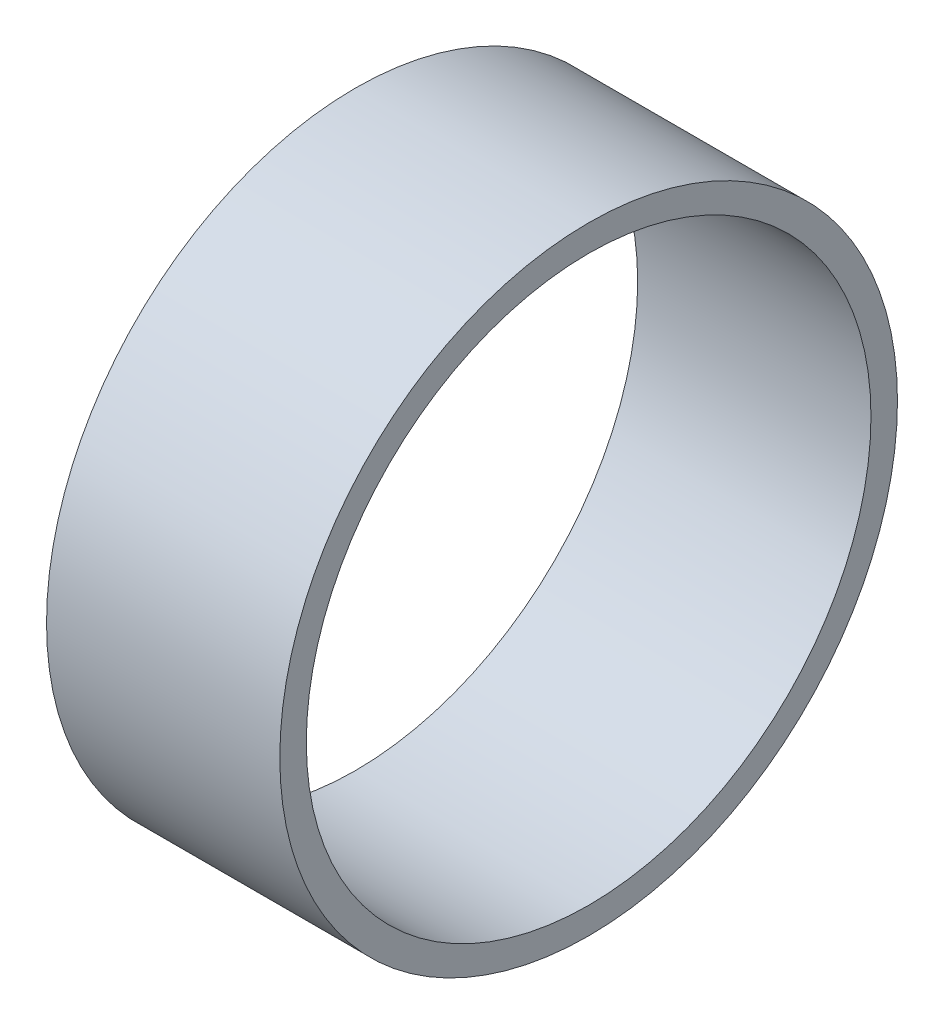
ISO-10303-21;
HEADER;
FILE_DESCRIPTION(('STEP AP214'),'2;1');
FILE_NAME('part.step','',(''),(''),'','','');
FILE_SCHEMA(('AUTOMOTIVE_DESIGN { 1 0 10303 214 1 1 1 1 }'));
ENDSEC;
DATA;
#1=APPLICATION_CONTEXT('core data for automotive mechanical design processes');
#2=APPLICATION_PROTOCOL_DEFINITION('international standard','automotive_design',2000,#1);
#3=PRODUCT_CONTEXT('',#1,'mechanical');
#4=PRODUCT('Part','Part','',(#3));
#5=PRODUCT_RELATED_PRODUCT_CATEGORY('part','',(#4));
#6=PRODUCT_DEFINITION_FORMATION('','',#4);
#7=PRODUCT_DEFINITION_CONTEXT('part definition',#1,'design');
#8=PRODUCT_DEFINITION('design','',#6,#7);
#9=PRODUCT_DEFINITION_SHAPE('','',#8);
#10=(LENGTH_UNIT() NAMED_UNIT(*) SI_UNIT(.MILLI.,.METRE.));
#11=(NAMED_UNIT(*) PLANE_ANGLE_UNIT() SI_UNIT($,.RADIAN.));
#12=(NAMED_UNIT(*) SI_UNIT($,.STERADIAN.) SOLID_ANGLE_UNIT());
#13=UNCERTAINTY_MEASURE_WITH_UNIT(LENGTH_MEASURE(1.E-05),#10,'distance_accuracy_value','');
#14=(GEOMETRIC_REPRESENTATION_CONTEXT(3) GLOBAL_UNCERTAINTY_ASSIGNED_CONTEXT((#13)) GLOBAL_UNIT_ASSIGNED_CONTEXT((#10,
#11,#12)) REPRESENTATION_CONTEXT('',''));
#15=CARTESIAN_POINT('',(0.,0.,0.));
#16=DIRECTION('',(0.,0.,1.));
#17=DIRECTION('',(1.,0.,0.));
#18=AXIS2_PLACEMENT_3D('',#15,#16,#17);
#19=CARTESIAN_POINT('',(8.8,20.1439926174438,-27.718012734749));
#20=DIRECTION('',(1.,0.,0.));
#21=DIRECTION('',(0.,0.,-1.));
#22=AXIS2_PLACEMENT_3D('',#19,#20,#21);
#23=PLANE('',#22);
#24=CARTESIAN_POINT('',(8.8,20.1439926174438,-27.718012734749));
#25=DIRECTION('',(1.,0.,0.));
#26=DIRECTION('',(0.,0.,-1.));
#27=AXIS2_PLACEMENT_3D('',#24,#25,#26);
#28=CIRCLE('',#27,11.6500000000003);
#29=CARTESIAN_POINT('',(8.8,20.1439926174438,-39.3680127347493));
#30=VERTEX_POINT('',#29);
#31=EDGE_CURVE('E12',#30,#30,#28,.T.);
#32=ORIENTED_EDGE('',*,*,#31,.T.);
#33=EDGE_LOOP('',(#32));
#34=FACE_BOUND('',#33,.T.);
#35=CARTESIAN_POINT('',(8.8,20.1439926174438,-27.718012734749));
#36=DIRECTION('',(1.,0.,0.));
#37=DIRECTION('',(0.,0.,-1.));
#38=AXIS2_PLACEMENT_3D('',#35,#36,#37);
#39=CIRCLE('',#38,10.6500000000003);
#40=CARTESIAN_POINT('',(8.8,20.1439926174438,-38.3680127347493));
#41=VERTEX_POINT('',#40);
#42=EDGE_CURVE('E55',#41,#41,#39,.T.);
#43=ORIENTED_EDGE('',*,*,#42,.F.);
#44=EDGE_LOOP('',(#43));
#45=FACE_BOUND('',#44,.T.);
#46=ADVANCED_FACE('F44',(#34,#45),#23,.T.);
#47=CARTESIAN_POINT('',(0.,20.1439926174438,-27.718012734749));
#48=DIRECTION('',(1.,0.,0.));
#49=DIRECTION('',(0.,0.,-1.));
#50=AXIS2_PLACEMENT_3D('',#47,#48,#49);
#51=PLANE('',#50);
#52=CARTESIAN_POINT('',(0.,20.1439926174438,-27.718012734749));
#53=DIRECTION('',(1.,0.,0.));
#54=DIRECTION('',(0.,0.,-1.));
#55=AXIS2_PLACEMENT_3D('',#52,#53,#54);
#56=CIRCLE('',#55,11.6500000000003);
#57=CARTESIAN_POINT('',(0.,20.1439926174438,-39.3680127347493));
#58=VERTEX_POINT('',#57);
#59=EDGE_CURVE('E48',#58,#58,#56,.T.);
#60=ORIENTED_EDGE('',*,*,#59,.F.);
#61=EDGE_LOOP('',(#60));
#62=FACE_BOUND('',#61,.T.);
#63=CARTESIAN_POINT('',(0.,20.1439926174438,-27.718012734749));
#64=DIRECTION('',(1.,0.,0.));
#65=DIRECTION('',(0.,0.,-1.));
#66=AXIS2_PLACEMENT_3D('',#63,#64,#65);
#67=CIRCLE('',#66,10.6500000000003);
#68=CARTESIAN_POINT('',(0.,20.1439926174438,-38.3680127347493));
#69=VERTEX_POINT('',#68);
#70=EDGE_CURVE('E57',#69,#69,#67,.T.);
#71=ORIENTED_EDGE('',*,*,#70,.T.);
#72=EDGE_LOOP('',(#71));
#73=FACE_BOUND('',#72,.T.);
#74=ADVANCED_FACE('F67',(#62,#73),#51,.F.);
#75=CARTESIAN_POINT('',(8.8,20.1439926174438,-27.718012734749));
#76=DIRECTION('',(-1.,0.,0.));
#77=DIRECTION('',(0.,0.,1.));
#78=AXIS2_PLACEMENT_3D('',#75,#76,#77);
#79=CYLINDRICAL_SURFACE('',#78,11.6500000000003);
#80=ORIENTED_EDGE('',*,*,#31,.F.);
#81=EDGE_LOOP('',(#80));
#82=FACE_BOUND('',#81,.T.);
#83=ORIENTED_EDGE('',*,*,#59,.T.);
#84=EDGE_LOOP('',(#83));
#85=FACE_BOUND('',#84,.T.);
#86=ADVANCED_FACE('F46',(#82,#85),#79,.T.);
#87=CARTESIAN_POINT('',(8.8,20.1439926174438,-27.718012734749));
#88=DIRECTION('',(-1.,0.,0.));
#89=DIRECTION('',(0.,0.,1.));
#90=AXIS2_PLACEMENT_3D('',#87,#88,#89);
#91=CYLINDRICAL_SURFACE('',#90,10.6500000000003);
#92=ORIENTED_EDGE('',*,*,#42,.T.);
#93=EDGE_LOOP('',(#92));
#94=FACE_BOUND('',#93,.T.);
#95=ORIENTED_EDGE('',*,*,#70,.F.);
#96=EDGE_LOOP('',(#95));
#97=FACE_BOUND('',#96,.T.);
#98=ADVANCED_FACE('F63',(#94,#97),#91,.F.);
#99=CLOSED_SHELL('',(#46,#74,#86,#98));
#100=MANIFOLD_SOLID_BREP('B2',#99);
#101=ADVANCED_BREP_SHAPE_REPRESENTATION('',(#18,#100),#14);
#102=SHAPE_DEFINITION_REPRESENTATION(#9,#101);
ENDSEC;
END-ISO-10303-21;
